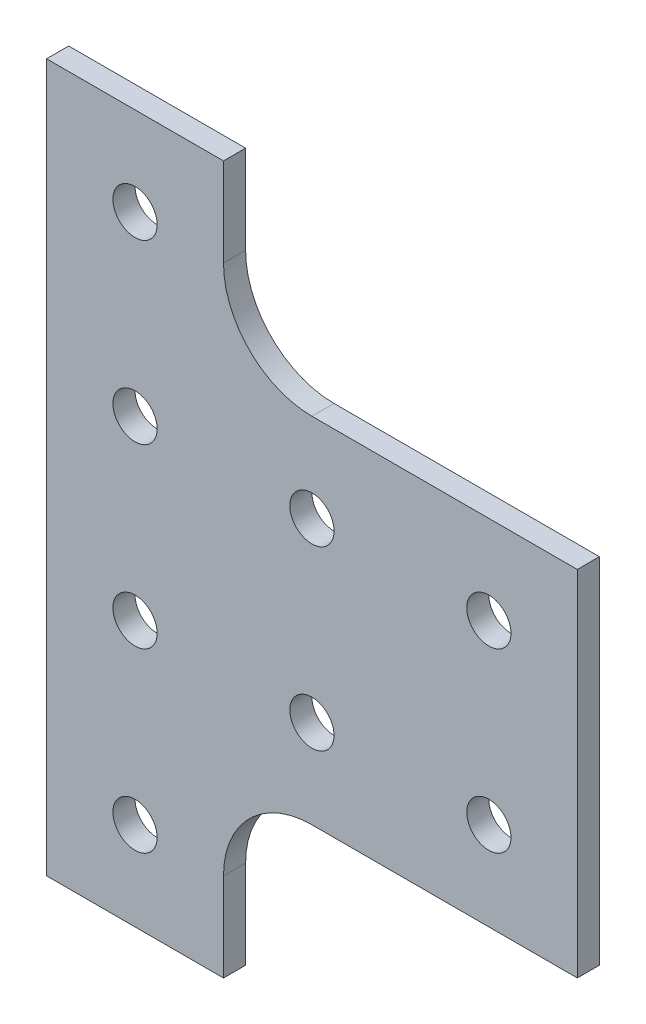
ISO-10303-21;
HEADER;
FILE_DESCRIPTION(('STEP AP214'),'2;1');
FILE_NAME('part.step','',(''),(''),'','','');
FILE_SCHEMA(('AUTOMOTIVE_DESIGN { 1 0 10303 214 1 1 1 1 }'));
ENDSEC;
DATA;
#1=APPLICATION_CONTEXT('core data for automotive mechanical design processes');
#2=APPLICATION_PROTOCOL_DEFINITION('international standard','automotive_design',2000,#1);
#3=PRODUCT_CONTEXT('',#1,'mechanical');
#4=PRODUCT('Part','Part','',(#3));
#5=PRODUCT_RELATED_PRODUCT_CATEGORY('part','',(#4));
#6=PRODUCT_DEFINITION_FORMATION('','',#4);
#7=PRODUCT_DEFINITION_CONTEXT('part definition',#1,'design');
#8=PRODUCT_DEFINITION('design','',#6,#7);
#9=PRODUCT_DEFINITION_SHAPE('','',#8);
#10=(LENGTH_UNIT() NAMED_UNIT(*) SI_UNIT(.MILLI.,.METRE.));
#11=(NAMED_UNIT(*) PLANE_ANGLE_UNIT() SI_UNIT($,.RADIAN.));
#12=(NAMED_UNIT(*) SI_UNIT($,.STERADIAN.) SOLID_ANGLE_UNIT());
#13=UNCERTAINTY_MEASURE_WITH_UNIT(LENGTH_MEASURE(1.E-05),#10,'distance_accuracy_value','');
#14=(GEOMETRIC_REPRESENTATION_CONTEXT(3) GLOBAL_UNCERTAINTY_ASSIGNED_CONTEXT((#13)) GLOBAL_UNIT_ASSIGNED_CONTEXT((#10,
#11,#12)) REPRESENTATION_CONTEXT('',''));
#15=CARTESIAN_POINT('',(0.,0.,0.));
#16=DIRECTION('',(0.,0.,1.));
#17=DIRECTION('',(1.,0.,0.));
#18=AXIS2_PLACEMENT_3D('',#15,#16,#17);
#19=CARTESIAN_POINT('',(0.,0.,3.175));
#20=DIRECTION('',(0.,0.,-1.));
#21=DIRECTION('',(-1.,0.,0.));
#22=AXIS2_PLACEMENT_3D('',#19,#20,#21);
#23=PLANE('',#22);
#24=DIRECTION('',(1.,0.,0.));
#25=VECTOR('',#24,1.);
#26=CARTESIAN_POINT('',(25.4,0.,3.175));
#27=LINE('',#26,#25);
#28=CARTESIAN_POINT('',(0.,0.,3.175));
#29=VERTEX_POINT('',#28);
#30=CARTESIAN_POINT('',(25.4,0.,3.175));
#31=VERTEX_POINT('',#30);
#32=EDGE_CURVE('E136',#29,#31,#27,.T.);
#33=ORIENTED_EDGE('',*,*,#32,.T.);
#34=DIRECTION('',(0.,1.,0.));
#35=VECTOR('',#34,1.);
#36=CARTESIAN_POINT('',(25.4,25.4,3.175));
#37=LINE('',#36,#35);
#38=CARTESIAN_POINT('',(25.4,12.7,3.175));
#39=VERTEX_POINT('',#38);
#40=EDGE_CURVE('E123',#31,#39,#37,.T.);
#41=ORIENTED_EDGE('',*,*,#40,.T.);
#42=CARTESIAN_POINT('',(38.1,12.7,3.175));
#43=DIRECTION('',(0.,0.,-1.));
#44=DIRECTION('',(-1.,0.,0.));
#45=AXIS2_PLACEMENT_3D('',#42,#43,#44);
#46=CIRCLE('',#45,12.7);
#47=CARTESIAN_POINT('',(38.1,25.4,3.175));
#48=VERTEX_POINT('',#47);
#49=EDGE_CURVE('E175',#39,#48,#46,.T.);
#50=ORIENTED_EDGE('',*,*,#49,.T.);
#51=DIRECTION('',(1.,0.,0.));
#52=VECTOR('',#51,1.);
#53=CARTESIAN_POINT('',(76.2,25.4,3.175));
#54=LINE('',#53,#52);
#55=CARTESIAN_POINT('',(76.2,25.4,3.175));
#56=VERTEX_POINT('',#55);
#57=EDGE_CURVE('E135',#48,#56,#54,.T.);
#58=ORIENTED_EDGE('',*,*,#57,.T.);
#59=DIRECTION('',(0.,1.,0.));
#60=VECTOR('',#59,1.);
#61=CARTESIAN_POINT('',(76.2,76.2,3.175));
#62=LINE('',#61,#60);
#63=CARTESIAN_POINT('',(76.2,76.2,3.175));
#64=VERTEX_POINT('',#63);
#65=EDGE_CURVE('E187',#56,#64,#62,.T.);
#66=ORIENTED_EDGE('',*,*,#65,.T.);
#67=DIRECTION('',(-1.,0.,0.));
#68=VECTOR('',#67,1.);
#69=CARTESIAN_POINT('',(25.4,76.2,3.175));
#70=LINE('',#69,#68);
#71=CARTESIAN_POINT('',(38.1,76.2,3.175));
#72=VERTEX_POINT('',#71);
#73=EDGE_CURVE('E232',#64,#72,#70,.T.);
#74=ORIENTED_EDGE('',*,*,#73,.T.);
#75=CARTESIAN_POINT('',(38.1,88.9,3.175));
#76=DIRECTION('',(0.,0.,-1.));
#77=DIRECTION('',(-1.,0.,0.));
#78=AXIS2_PLACEMENT_3D('',#75,#76,#77);
#79=CIRCLE('',#78,12.7);
#80=CARTESIAN_POINT('',(25.4,88.9,3.175));
#81=VERTEX_POINT('',#80);
#82=EDGE_CURVE('E11',#72,#81,#79,.T.);
#83=ORIENTED_EDGE('',*,*,#82,.T.);
#84=DIRECTION('',(0.,1.,0.));
#85=VECTOR('',#84,1.);
#86=CARTESIAN_POINT('',(25.4,101.6,3.175));
#87=LINE('',#86,#85);
#88=CARTESIAN_POINT('',(25.4,101.6,3.175));
#89=VERTEX_POINT('',#88);
#90=EDGE_CURVE('E238',#81,#89,#87,.T.);
#91=ORIENTED_EDGE('',*,*,#90,.T.);
#92=DIRECTION('',(-1.,0.,0.));
#93=VECTOR('',#92,1.);
#94=CARTESIAN_POINT('',(0.,101.6,3.175));
#95=LINE('',#94,#93);
#96=CARTESIAN_POINT('',(0.,101.6,3.175));
#97=VERTEX_POINT('',#96);
#98=EDGE_CURVE('E243',#89,#97,#95,.T.);
#99=ORIENTED_EDGE('',*,*,#98,.T.);
#100=DIRECTION('',(0.,-1.,0.));
#101=VECTOR('',#100,1.);
#102=CARTESIAN_POINT('',(0.,0.,3.175));
#103=LINE('',#102,#101);
#104=EDGE_CURVE('E141',#97,#29,#103,.T.);
#105=ORIENTED_EDGE('',*,*,#104,.T.);
#106=EDGE_LOOP('',(#33,#41,#50,#58,#66,#74,#83,#91,#99,#105));
#107=FACE_BOUND('',#106,.T.);
#108=CARTESIAN_POINT('',(12.7,88.9,3.175));
#109=DIRECTION('',(0.,0.,1.));
#110=DIRECTION('',(1.,0.,0.));
#111=AXIS2_PLACEMENT_3D('',#108,#109,#110);
#112=CIRCLE('',#111,3.175);
#113=CARTESIAN_POINT('',(15.875,88.9,3.175));
#114=VERTEX_POINT('',#113);
#115=EDGE_CURVE('E201',#114,#114,#112,.T.);
#116=ORIENTED_EDGE('',*,*,#115,.F.);
#117=EDGE_LOOP('',(#116));
#118=FACE_BOUND('',#117,.T.);
#119=CARTESIAN_POINT('',(12.7,63.5,3.175));
#120=DIRECTION('',(0.,0.,1.));
#121=DIRECTION('',(1.,0.,0.));
#122=AXIS2_PLACEMENT_3D('',#119,#120,#121);
#123=CIRCLE('',#122,3.175);
#124=CARTESIAN_POINT('',(15.875,63.5,3.175));
#125=VERTEX_POINT('',#124);
#126=EDGE_CURVE('E490',#125,#125,#123,.T.);
#127=ORIENTED_EDGE('',*,*,#126,.F.);
#128=EDGE_LOOP('',(#127));
#129=FACE_BOUND('',#128,.T.);
#130=CARTESIAN_POINT('',(12.7,38.1,3.175));
#131=DIRECTION('',(0.,0.,1.));
#132=DIRECTION('',(1.,0.,0.));
#133=AXIS2_PLACEMENT_3D('',#130,#131,#132);
#134=CIRCLE('',#133,3.175);
#135=CARTESIAN_POINT('',(15.875,38.1,3.175));
#136=VERTEX_POINT('',#135);
#137=EDGE_CURVE('E482',#136,#136,#134,.T.);
#138=ORIENTED_EDGE('',*,*,#137,.F.);
#139=EDGE_LOOP('',(#138));
#140=FACE_BOUND('',#139,.T.);
#141=CARTESIAN_POINT('',(12.7,12.7,3.175));
#142=DIRECTION('',(0.,0.,1.));
#143=DIRECTION('',(1.,0.,0.));
#144=AXIS2_PLACEMENT_3D('',#141,#142,#143);
#145=CIRCLE('',#144,3.175);
#146=CARTESIAN_POINT('',(15.875,12.7,3.175));
#147=VERTEX_POINT('',#146);
#148=EDGE_CURVE('E474',#147,#147,#145,.T.);
#149=ORIENTED_EDGE('',*,*,#148,.F.);
#150=EDGE_LOOP('',(#149));
#151=FACE_BOUND('',#150,.T.);
#152=CARTESIAN_POINT('',(38.1,63.5,3.175));
#153=DIRECTION('',(0.,0.,1.));
#154=DIRECTION('',(1.,0.,0.));
#155=AXIS2_PLACEMENT_3D('',#152,#153,#154);
#156=CIRCLE('',#155,3.175);
#157=CARTESIAN_POINT('',(41.275,63.5,3.175));
#158=VERTEX_POINT('',#157);
#159=EDGE_CURVE('E466',#158,#158,#156,.T.);
#160=ORIENTED_EDGE('',*,*,#159,.F.);
#161=EDGE_LOOP('',(#160));
#162=FACE_BOUND('',#161,.T.);
#163=CARTESIAN_POINT('',(38.1,38.1,3.175));
#164=DIRECTION('',(0.,0.,1.));
#165=DIRECTION('',(1.,0.,0.));
#166=AXIS2_PLACEMENT_3D('',#163,#164,#165);
#167=CIRCLE('',#166,3.175);
#168=CARTESIAN_POINT('',(41.275,38.1,3.175));
#169=VERTEX_POINT('',#168);
#170=EDGE_CURVE('E458',#169,#169,#167,.T.);
#171=ORIENTED_EDGE('',*,*,#170,.F.);
#172=EDGE_LOOP('',(#171));
#173=FACE_BOUND('',#172,.T.);
#174=CARTESIAN_POINT('',(63.5,63.5,3.175));
#175=DIRECTION('',(0.,0.,1.));
#176=DIRECTION('',(1.,0.,0.));
#177=AXIS2_PLACEMENT_3D('',#174,#175,#176);
#178=CIRCLE('',#177,3.175);
#179=CARTESIAN_POINT('',(66.675,63.5,3.175));
#180=VERTEX_POINT('',#179);
#181=EDGE_CURVE('E450',#180,#180,#178,.T.);
#182=ORIENTED_EDGE('',*,*,#181,.F.);
#183=EDGE_LOOP('',(#182));
#184=FACE_BOUND('',#183,.T.);
#185=CARTESIAN_POINT('',(63.5,38.1,3.175));
#186=DIRECTION('',(0.,0.,1.));
#187=DIRECTION('',(1.,0.,0.));
#188=AXIS2_PLACEMENT_3D('',#185,#186,#187);
#189=CIRCLE('',#188,3.175);
#190=CARTESIAN_POINT('',(66.675,38.1,3.175));
#191=VERTEX_POINT('',#190);
#192=EDGE_CURVE('E439',#191,#191,#189,.T.);
#193=ORIENTED_EDGE('',*,*,#192,.F.);
#194=EDGE_LOOP('',(#193));
#195=FACE_BOUND('',#194,.T.);
#196=ADVANCED_FACE('F45',(#107,#118,#129,#140,#151,#162,#173,#184,#195),#23,.F.);
#197=CARTESIAN_POINT('',(0.,0.,0.));
#198=DIRECTION('',(0.,0.,-1.));
#199=DIRECTION('',(-1.,0.,0.));
#200=AXIS2_PLACEMENT_3D('',#197,#198,#199);
#201=PLANE('',#200);
#202=CARTESIAN_POINT('',(63.5,63.5,0.));
#203=DIRECTION('',(0.,0.,1.));
#204=DIRECTION('',(1.,0.,0.));
#205=AXIS2_PLACEMENT_3D('',#202,#203,#204);
#206=CIRCLE('',#205,3.175);
#207=CARTESIAN_POINT('',(66.675,63.5,0.));
#208=VERTEX_POINT('',#207);
#209=EDGE_CURVE('E447',#208,#208,#206,.T.);
#210=ORIENTED_EDGE('',*,*,#209,.T.);
#211=EDGE_LOOP('',(#210));
#212=FACE_BOUND('',#211,.T.);
#213=CARTESIAN_POINT('',(38.1,63.5,0.));
#214=DIRECTION('',(0.,0.,1.));
#215=DIRECTION('',(1.,0.,0.));
#216=AXIS2_PLACEMENT_3D('',#213,#214,#215);
#217=CIRCLE('',#216,3.175);
#218=CARTESIAN_POINT('',(41.275,63.5,0.));
#219=VERTEX_POINT('',#218);
#220=EDGE_CURVE('E462',#219,#219,#217,.T.);
#221=ORIENTED_EDGE('',*,*,#220,.T.);
#222=EDGE_LOOP('',(#221));
#223=FACE_BOUND('',#222,.T.);
#224=CARTESIAN_POINT('',(12.7,38.1,0.));
#225=DIRECTION('',(0.,0.,1.));
#226=DIRECTION('',(1.,0.,0.));
#227=AXIS2_PLACEMENT_3D('',#224,#225,#226);
#228=CIRCLE('',#227,3.175);
#229=CARTESIAN_POINT('',(15.875,38.1,0.));
#230=VERTEX_POINT('',#229);
#231=EDGE_CURVE('E478',#230,#230,#228,.T.);
#232=ORIENTED_EDGE('',*,*,#231,.T.);
#233=EDGE_LOOP('',(#232));
#234=FACE_BOUND('',#233,.T.);
#235=CARTESIAN_POINT('',(12.7,88.9,0.));
#236=DIRECTION('',(0.,0.,1.));
#237=DIRECTION('',(1.,0.,0.));
#238=AXIS2_PLACEMENT_3D('',#235,#236,#237);
#239=CIRCLE('',#238,3.175);
#240=CARTESIAN_POINT('',(15.875,88.9,0.));
#241=VERTEX_POINT('',#240);
#242=EDGE_CURVE('E494',#241,#241,#239,.T.);
#243=ORIENTED_EDGE('',*,*,#242,.T.);
#244=EDGE_LOOP('',(#243));
#245=FACE_BOUND('',#244,.T.);
#246=DIRECTION('',(1.,0.,0.));
#247=VECTOR('',#246,1.);
#248=CARTESIAN_POINT('',(25.4,0.,0.));
#249=LINE('',#248,#247);
#250=CARTESIAN_POINT('',(0.,0.,0.));
#251=VERTEX_POINT('',#250);
#252=CARTESIAN_POINT('',(25.4,0.,0.));
#253=VERTEX_POINT('',#252);
#254=EDGE_CURVE('E150',#251,#253,#249,.T.);
#255=ORIENTED_EDGE('',*,*,#254,.F.);
#256=DIRECTION('',(0.,-1.,0.));
#257=VECTOR('',#256,1.);
#258=CARTESIAN_POINT('',(0.,0.,0.));
#259=LINE('',#258,#257);
#260=CARTESIAN_POINT('',(0.,101.6,0.));
#261=VERTEX_POINT('',#260);
#262=EDGE_CURVE('E146',#261,#251,#259,.T.);
#263=ORIENTED_EDGE('',*,*,#262,.F.);
#264=DIRECTION('',(-1.,0.,0.));
#265=VECTOR('',#264,1.);
#266=CARTESIAN_POINT('',(0.,101.6,0.));
#267=LINE('',#266,#265);
#268=CARTESIAN_POINT('',(25.4,101.6,0.));
#269=VERTEX_POINT('',#268);
#270=EDGE_CURVE('E213',#269,#261,#267,.T.);
#271=ORIENTED_EDGE('',*,*,#270,.F.);
#272=DIRECTION('',(0.,1.,0.));
#273=VECTOR('',#272,1.);
#274=CARTESIAN_POINT('',(25.4,101.6,0.));
#275=LINE('',#274,#273);
#276=CARTESIAN_POINT('',(25.4,88.9,0.));
#277=VERTEX_POINT('',#276);
#278=EDGE_CURVE('E210',#277,#269,#275,.T.);
#279=ORIENTED_EDGE('',*,*,#278,.F.);
#280=CARTESIAN_POINT('',(38.1,88.9,0.));
#281=DIRECTION('',(0.,0.,-1.));
#282=DIRECTION('',(-1.,0.,0.));
#283=AXIS2_PLACEMENT_3D('',#280,#281,#282);
#284=CIRCLE('',#283,12.7);
#285=CARTESIAN_POINT('',(38.1,76.2,0.));
#286=VERTEX_POINT('',#285);
#287=EDGE_CURVE('E54',#277,#286,#284,.F.);
#288=ORIENTED_EDGE('',*,*,#287,.T.);
#289=DIRECTION('',(-1.,0.,0.));
#290=VECTOR('',#289,1.);
#291=CARTESIAN_POINT('',(25.4,76.2,0.));
#292=LINE('',#291,#290);
#293=CARTESIAN_POINT('',(76.2,76.2,0.));
#294=VERTEX_POINT('',#293);
#295=EDGE_CURVE('E207',#294,#286,#292,.T.);
#296=ORIENTED_EDGE('',*,*,#295,.F.);
#297=DIRECTION('',(0.,1.,0.));
#298=VECTOR('',#297,1.);
#299=CARTESIAN_POINT('',(76.2,76.2,0.));
#300=LINE('',#299,#298);
#301=CARTESIAN_POINT('',(76.2,25.4,0.));
#302=VERTEX_POINT('',#301);
#303=EDGE_CURVE('E199',#302,#294,#300,.T.);
#304=ORIENTED_EDGE('',*,*,#303,.F.);
#305=DIRECTION('',(1.,0.,0.));
#306=VECTOR('',#305,1.);
#307=CARTESIAN_POINT('',(76.2,25.4,0.));
#308=LINE('',#307,#306);
#309=CARTESIAN_POINT('',(38.1,25.4,0.));
#310=VERTEX_POINT('',#309);
#311=EDGE_CURVE('E194',#310,#302,#308,.T.);
#312=ORIENTED_EDGE('',*,*,#311,.F.);
#313=CARTESIAN_POINT('',(38.1,12.7,0.));
#314=DIRECTION('',(0.,0.,-1.));
#315=DIRECTION('',(-1.,0.,0.));
#316=AXIS2_PLACEMENT_3D('',#313,#314,#315);
#317=CIRCLE('',#316,12.7);
#318=CARTESIAN_POINT('',(25.4,12.7,0.));
#319=VERTEX_POINT('',#318);
#320=EDGE_CURVE('E172',#310,#319,#317,.F.);
#321=ORIENTED_EDGE('',*,*,#320,.T.);
#322=DIRECTION('',(0.,1.,0.));
#323=VECTOR('',#322,1.);
#324=CARTESIAN_POINT('',(25.4,25.4,0.));
#325=LINE('',#324,#323);
#326=EDGE_CURVE('E192',#253,#319,#325,.T.);
#327=ORIENTED_EDGE('',*,*,#326,.F.);
#328=EDGE_LOOP('',(#255,#263,#271,#279,#288,#296,#304,#312,#321,#327));
#329=FACE_BOUND('',#328,.T.);
#330=CARTESIAN_POINT('',(12.7,63.5,0.));
#331=DIRECTION('',(0.,0.,1.));
#332=DIRECTION('',(1.,0.,0.));
#333=AXIS2_PLACEMENT_3D('',#330,#331,#332);
#334=CIRCLE('',#333,3.175);
#335=CARTESIAN_POINT('',(15.875,63.5,0.));
#336=VERTEX_POINT('',#335);
#337=EDGE_CURVE('E486',#336,#336,#334,.T.);
#338=ORIENTED_EDGE('',*,*,#337,.T.);
#339=EDGE_LOOP('',(#338));
#340=FACE_BOUND('',#339,.T.);
#341=CARTESIAN_POINT('',(12.7,12.7,0.));
#342=DIRECTION('',(0.,0.,1.));
#343=DIRECTION('',(1.,0.,0.));
#344=AXIS2_PLACEMENT_3D('',#341,#342,#343);
#345=CIRCLE('',#344,3.175);
#346=CARTESIAN_POINT('',(15.875,12.7,0.));
#347=VERTEX_POINT('',#346);
#348=EDGE_CURVE('E470',#347,#347,#345,.T.);
#349=ORIENTED_EDGE('',*,*,#348,.T.);
#350=EDGE_LOOP('',(#349));
#351=FACE_BOUND('',#350,.T.);
#352=CARTESIAN_POINT('',(38.1,38.1,0.));
#353=DIRECTION('',(0.,0.,1.));
#354=DIRECTION('',(1.,0.,0.));
#355=AXIS2_PLACEMENT_3D('',#352,#353,#354);
#356=CIRCLE('',#355,3.175);
#357=CARTESIAN_POINT('',(41.275,38.1,0.));
#358=VERTEX_POINT('',#357);
#359=EDGE_CURVE('E454',#358,#358,#356,.T.);
#360=ORIENTED_EDGE('',*,*,#359,.T.);
#361=EDGE_LOOP('',(#360));
#362=FACE_BOUND('',#361,.T.);
#363=CARTESIAN_POINT('',(63.5,38.1,0.));
#364=DIRECTION('',(0.,0.,1.));
#365=DIRECTION('',(1.,0.,0.));
#366=AXIS2_PLACEMENT_3D('',#363,#364,#365);
#367=CIRCLE('',#366,3.175);
#368=CARTESIAN_POINT('',(66.675,38.1,0.));
#369=VERTEX_POINT('',#368);
#370=EDGE_CURVE('E442',#369,#369,#367,.T.);
#371=ORIENTED_EDGE('',*,*,#370,.T.);
#372=EDGE_LOOP('',(#371));
#373=FACE_BOUND('',#372,.T.);
#374=ADVANCED_FACE('F190',(#212,#223,#234,#245,#329,#340,#351,#362,#373),#201,.T.);
#375=CARTESIAN_POINT('',(25.4,0.,3.175));
#376=DIRECTION('',(0.,1.,0.));
#377=DIRECTION('',(-1.,0.,0.));
#378=AXIS2_PLACEMENT_3D('',#375,#376,#377);
#379=PLANE('',#378);
#380=ORIENTED_EDGE('',*,*,#254,.T.);
#381=DIRECTION('',(0.,0.,-1.));
#382=VECTOR('',#381,1.);
#383=CARTESIAN_POINT('',(25.4,0.,3.175));
#384=LINE('',#383,#382);
#385=EDGE_CURVE('E128',#31,#253,#384,.T.);
#386=ORIENTED_EDGE('',*,*,#385,.F.);
#387=ORIENTED_EDGE('',*,*,#32,.F.);
#388=DIRECTION('',(0.,0.,-1.));
#389=VECTOR('',#388,1.);
#390=CARTESIAN_POINT('',(0.,0.,3.175));
#391=LINE('',#390,#389);
#392=EDGE_CURVE('E218',#29,#251,#391,.T.);
#393=ORIENTED_EDGE('',*,*,#392,.T.);
#394=EDGE_LOOP('',(#380,#386,#387,#393));
#395=FACE_BOUND('',#394,.T.);
#396=ADVANCED_FACE('F148',(#395),#379,.F.);
#397=CARTESIAN_POINT('',(25.4,25.4,3.175));
#398=DIRECTION('',(-1.,0.,0.));
#399=DIRECTION('',(0.,-1.,0.));
#400=AXIS2_PLACEMENT_3D('',#397,#398,#399);
#401=PLANE('',#400);
#402=ORIENTED_EDGE('',*,*,#326,.T.);
#403=DIRECTION('',(0.,0.,-1.));
#404=VECTOR('',#403,1.);
#405=CARTESIAN_POINT('',(25.4,12.7,3.175));
#406=LINE('',#405,#404);
#407=EDGE_CURVE('E131',#319,#39,#406,.F.);
#408=ORIENTED_EDGE('',*,*,#407,.T.);
#409=ORIENTED_EDGE('',*,*,#40,.F.);
#410=ORIENTED_EDGE('',*,*,#385,.T.);
#411=EDGE_LOOP('',(#402,#408,#409,#410));
#412=FACE_BOUND('',#411,.T.);
#413=ADVANCED_FACE('F126',(#412),#401,.F.);
#414=CARTESIAN_POINT('',(76.2,25.4,3.175));
#415=DIRECTION('',(0.,1.,0.));
#416=DIRECTION('',(-1.,0.,0.));
#417=AXIS2_PLACEMENT_3D('',#414,#415,#416);
#418=PLANE('',#417);
#419=ORIENTED_EDGE('',*,*,#57,.F.);
#420=DIRECTION('',(0.,0.,-1.));
#421=VECTOR('',#420,1.);
#422=CARTESIAN_POINT('',(38.1,25.4,0.));
#423=LINE('',#422,#421);
#424=EDGE_CURVE('E152',#48,#310,#423,.T.);
#425=ORIENTED_EDGE('',*,*,#424,.T.);
#426=ORIENTED_EDGE('',*,*,#311,.T.);
#427=DIRECTION('',(0.,0.,-1.));
#428=VECTOR('',#427,1.);
#429=CARTESIAN_POINT('',(76.2,25.4,3.175));
#430=LINE('',#429,#428);
#431=EDGE_CURVE('E153',#56,#302,#430,.T.);
#432=ORIENTED_EDGE('',*,*,#431,.F.);
#433=EDGE_LOOP('',(#419,#425,#426,#432));
#434=FACE_BOUND('',#433,.T.);
#435=ADVANCED_FACE('F183',(#434),#418,.F.);
#436=CARTESIAN_POINT('',(76.2,76.2,3.175));
#437=DIRECTION('',(-1.,0.,0.));
#438=DIRECTION('',(0.,-1.,0.));
#439=AXIS2_PLACEMENT_3D('',#436,#437,#438);
#440=PLANE('',#439);
#441=ORIENTED_EDGE('',*,*,#303,.T.);
#442=DIRECTION('',(0.,0.,-1.));
#443=VECTOR('',#442,1.);
#444=CARTESIAN_POINT('',(76.2,76.2,3.175));
#445=LINE('',#444,#443);
#446=EDGE_CURVE('E160',#64,#294,#445,.T.);
#447=ORIENTED_EDGE('',*,*,#446,.F.);
#448=ORIENTED_EDGE('',*,*,#65,.F.);
#449=ORIENTED_EDGE('',*,*,#431,.T.);
#450=EDGE_LOOP('',(#441,#447,#448,#449));
#451=FACE_BOUND('',#450,.T.);
#452=ADVANCED_FACE('F234',(#451),#440,.F.);
#453=CARTESIAN_POINT('',(25.4,76.2,3.175));
#454=DIRECTION('',(0.,-1.,0.));
#455=DIRECTION('',(0.,0.,-1.));
#456=AXIS2_PLACEMENT_3D('',#453,#454,#455);
#457=PLANE('',#456);
#458=ORIENTED_EDGE('',*,*,#295,.T.);
#459=DIRECTION('',(0.,0.,-1.));
#460=VECTOR('',#459,1.);
#461=CARTESIAN_POINT('',(38.1,76.2,3.175));
#462=LINE('',#461,#460);
#463=EDGE_CURVE('E61',#286,#72,#462,.F.);
#464=ORIENTED_EDGE('',*,*,#463,.T.);
#465=ORIENTED_EDGE('',*,*,#73,.F.);
#466=ORIENTED_EDGE('',*,*,#446,.T.);
#467=EDGE_LOOP('',(#458,#464,#465,#466));
#468=FACE_BOUND('',#467,.T.);
#469=ADVANCED_FACE('F231',(#468),#457,.F.);
#470=CARTESIAN_POINT('',(25.4,101.6,3.175));
#471=DIRECTION('',(-1.,0.,0.));
#472=DIRECTION('',(0.,0.,1.));
#473=AXIS2_PLACEMENT_3D('',#470,#471,#472);
#474=PLANE('',#473);
#475=ORIENTED_EDGE('',*,*,#90,.F.);
#476=DIRECTION('',(0.,0.,-1.));
#477=VECTOR('',#476,1.);
#478=CARTESIAN_POINT('',(25.4,88.9,0.));
#479=LINE('',#478,#477);
#480=EDGE_CURVE('E166',#81,#277,#479,.T.);
#481=ORIENTED_EDGE('',*,*,#480,.T.);
#482=ORIENTED_EDGE('',*,*,#278,.T.);
#483=DIRECTION('',(0.,0.,-1.));
#484=VECTOR('',#483,1.);
#485=CARTESIAN_POINT('',(25.4,101.6,3.175));
#486=LINE('',#485,#484);
#487=EDGE_CURVE('E225',#89,#269,#486,.T.);
#488=ORIENTED_EDGE('',*,*,#487,.F.);
#489=EDGE_LOOP('',(#475,#481,#482,#488));
#490=FACE_BOUND('',#489,.T.);
#491=ADVANCED_FACE('F257',(#490),#474,.F.);
#492=CARTESIAN_POINT('',(0.,101.6,3.175));
#493=DIRECTION('',(0.,-1.,0.));
#494=DIRECTION('',(0.,0.,-1.));
#495=AXIS2_PLACEMENT_3D('',#492,#493,#494);
#496=PLANE('',#495);
#497=ORIENTED_EDGE('',*,*,#270,.T.);
#498=DIRECTION('',(0.,0.,-1.));
#499=VECTOR('',#498,1.);
#500=CARTESIAN_POINT('',(0.,101.6,3.175));
#501=LINE('',#500,#499);
#502=EDGE_CURVE('E221',#97,#261,#501,.T.);
#503=ORIENTED_EDGE('',*,*,#502,.F.);
#504=ORIENTED_EDGE('',*,*,#98,.F.);
#505=ORIENTED_EDGE('',*,*,#487,.T.);
#506=EDGE_LOOP('',(#497,#503,#504,#505));
#507=FACE_BOUND('',#506,.T.);
#508=ADVANCED_FACE('F251',(#507),#496,.F.);
#509=CARTESIAN_POINT('',(0.,0.,3.175));
#510=DIRECTION('',(1.,0.,0.));
#511=DIRECTION('',(0.,0.,-1.));
#512=AXIS2_PLACEMENT_3D('',#509,#510,#511);
#513=PLANE('',#512);
#514=ORIENTED_EDGE('',*,*,#262,.T.);
#515=ORIENTED_EDGE('',*,*,#392,.F.);
#516=ORIENTED_EDGE('',*,*,#104,.F.);
#517=ORIENTED_EDGE('',*,*,#502,.T.);
#518=EDGE_LOOP('',(#514,#515,#516,#517));
#519=FACE_BOUND('',#518,.T.);
#520=ADVANCED_FACE('F255',(#519),#513,.F.);
#521=CARTESIAN_POINT('',(12.7,88.9,3.175));
#522=DIRECTION('',(0.,0.,-1.));
#523=DIRECTION('',(-1.,0.,0.));
#524=AXIS2_PLACEMENT_3D('',#521,#522,#523);
#525=CYLINDRICAL_SURFACE('',#524,3.175);
#526=ORIENTED_EDGE('',*,*,#115,.T.);
#527=EDGE_LOOP('',(#526));
#528=FACE_BOUND('',#527,.T.);
#529=ORIENTED_EDGE('',*,*,#242,.F.);
#530=EDGE_LOOP('',(#529));
#531=FACE_BOUND('',#530,.T.);
#532=ADVANCED_FACE('F275',(#528,#531),#525,.F.);
#533=CARTESIAN_POINT('',(12.7,63.5,3.175));
#534=DIRECTION('',(0.,0.,-1.));
#535=DIRECTION('',(-1.,0.,0.));
#536=AXIS2_PLACEMENT_3D('',#533,#534,#535);
#537=CYLINDRICAL_SURFACE('',#536,3.175);
#538=ORIENTED_EDGE('',*,*,#126,.T.);
#539=EDGE_LOOP('',(#538));
#540=FACE_BOUND('',#539,.T.);
#541=ORIENTED_EDGE('',*,*,#337,.F.);
#542=EDGE_LOOP('',(#541));
#543=FACE_BOUND('',#542,.T.);
#544=ADVANCED_FACE('F322',(#540,#543),#537,.F.);
#545=CARTESIAN_POINT('',(12.7,38.1,3.175));
#546=DIRECTION('',(0.,0.,-1.));
#547=DIRECTION('',(-1.,0.,0.));
#548=AXIS2_PLACEMENT_3D('',#545,#546,#547);
#549=CYLINDRICAL_SURFACE('',#548,3.175);
#550=ORIENTED_EDGE('',*,*,#137,.T.);
#551=EDGE_LOOP('',(#550));
#552=FACE_BOUND('',#551,.T.);
#553=ORIENTED_EDGE('',*,*,#231,.F.);
#554=EDGE_LOOP('',(#553));
#555=FACE_BOUND('',#554,.T.);
#556=ADVANCED_FACE('F330',(#552,#555),#549,.F.);
#557=CARTESIAN_POINT('',(12.7,12.7,3.175));
#558=DIRECTION('',(0.,0.,-1.));
#559=DIRECTION('',(-1.,0.,0.));
#560=AXIS2_PLACEMENT_3D('',#557,#558,#559);
#561=CYLINDRICAL_SURFACE('',#560,3.175);
#562=ORIENTED_EDGE('',*,*,#148,.T.);
#563=EDGE_LOOP('',(#562));
#564=FACE_BOUND('',#563,.T.);
#565=ORIENTED_EDGE('',*,*,#348,.F.);
#566=EDGE_LOOP('',(#565));
#567=FACE_BOUND('',#566,.T.);
#568=ADVANCED_FACE('F338',(#564,#567),#561,.F.);
#569=CARTESIAN_POINT('',(38.1,63.5,3.175));
#570=DIRECTION('',(0.,0.,-1.));
#571=DIRECTION('',(-1.,0.,0.));
#572=AXIS2_PLACEMENT_3D('',#569,#570,#571);
#573=CYLINDRICAL_SURFACE('',#572,3.175);
#574=ORIENTED_EDGE('',*,*,#159,.T.);
#575=EDGE_LOOP('',(#574));
#576=FACE_BOUND('',#575,.T.);
#577=ORIENTED_EDGE('',*,*,#220,.F.);
#578=EDGE_LOOP('',(#577));
#579=FACE_BOUND('',#578,.T.);
#580=ADVANCED_FACE('F347',(#576,#579),#573,.F.);
#581=CARTESIAN_POINT('',(38.1,38.1,3.175));
#582=DIRECTION('',(0.,0.,-1.));
#583=DIRECTION('',(-1.,0.,0.));
#584=AXIS2_PLACEMENT_3D('',#581,#582,#583);
#585=CYLINDRICAL_SURFACE('',#584,3.175);
#586=ORIENTED_EDGE('',*,*,#170,.T.);
#587=EDGE_LOOP('',(#586));
#588=FACE_BOUND('',#587,.T.);
#589=ORIENTED_EDGE('',*,*,#359,.F.);
#590=EDGE_LOOP('',(#589));
#591=FACE_BOUND('',#590,.T.);
#592=ADVANCED_FACE('F356',(#588,#591),#585,.F.);
#593=CARTESIAN_POINT('',(63.5,63.5,3.175));
#594=DIRECTION('',(0.,0.,-1.));
#595=DIRECTION('',(-1.,0.,0.));
#596=AXIS2_PLACEMENT_3D('',#593,#594,#595);
#597=CYLINDRICAL_SURFACE('',#596,3.175);
#598=ORIENTED_EDGE('',*,*,#181,.T.);
#599=EDGE_LOOP('',(#598));
#600=FACE_BOUND('',#599,.T.);
#601=ORIENTED_EDGE('',*,*,#209,.F.);
#602=EDGE_LOOP('',(#601));
#603=FACE_BOUND('',#602,.T.);
#604=ADVANCED_FACE('F365',(#600,#603),#597,.F.);
#605=CARTESIAN_POINT('',(63.5,38.1,3.175));
#606=DIRECTION('',(0.,0.,-1.));
#607=DIRECTION('',(-1.,0.,0.));
#608=AXIS2_PLACEMENT_3D('',#605,#606,#607);
#609=CYLINDRICAL_SURFACE('',#608,3.175);
#610=ORIENTED_EDGE('',*,*,#192,.T.);
#611=EDGE_LOOP('',(#610));
#612=FACE_BOUND('',#611,.T.);
#613=ORIENTED_EDGE('',*,*,#370,.F.);
#614=EDGE_LOOP('',(#613));
#615=FACE_BOUND('',#614,.T.);
#616=ADVANCED_FACE('F265',(#612,#615),#609,.F.);
#617=CARTESIAN_POINT('',(38.1,12.7,3.175));
#618=DIRECTION('',(0.,0.,1.));
#619=DIRECTION('',(1.,0.,0.));
#620=AXIS2_PLACEMENT_3D('',#617,#618,#619);
#621=CYLINDRICAL_SURFACE('',#620,12.7);
#622=ORIENTED_EDGE('',*,*,#49,.F.);
#623=ORIENTED_EDGE('',*,*,#407,.F.);
#624=ORIENTED_EDGE('',*,*,#320,.F.);
#625=ORIENTED_EDGE('',*,*,#424,.F.);
#626=EDGE_LOOP('',(#622,#623,#624,#625));
#627=FACE_BOUND('',#626,.T.);
#628=ADVANCED_FACE('F189',(#627),#621,.F.);
#629=CARTESIAN_POINT('',(38.1,88.9,3.175));
#630=DIRECTION('',(0.,0.,1.));
#631=DIRECTION('',(1.,0.,0.));
#632=AXIS2_PLACEMENT_3D('',#629,#630,#631);
#633=CYLINDRICAL_SURFACE('',#632,12.7);
#634=ORIENTED_EDGE('',*,*,#82,.F.);
#635=ORIENTED_EDGE('',*,*,#463,.F.);
#636=ORIENTED_EDGE('',*,*,#287,.F.);
#637=ORIENTED_EDGE('',*,*,#480,.F.);
#638=EDGE_LOOP('',(#634,#635,#636,#637));
#639=FACE_BOUND('',#638,.T.);
#640=ADVANCED_FACE('F47',(#639),#633,.F.);
#641=CLOSED_SHELL('',(#196,#374,#396,#413,#435,#452,#469,#491,#508,#520,#532,#544,#556,#568,
#580,#592,#604,#616,#628,#640));
#642=MANIFOLD_SOLID_BREP('B2',#641);
#643=ADVANCED_BREP_SHAPE_REPRESENTATION('',(#18,#642),#14);
#644=SHAPE_DEFINITION_REPRESENTATION(#9,#643);
ENDSEC;
END-ISO-10303-21;
